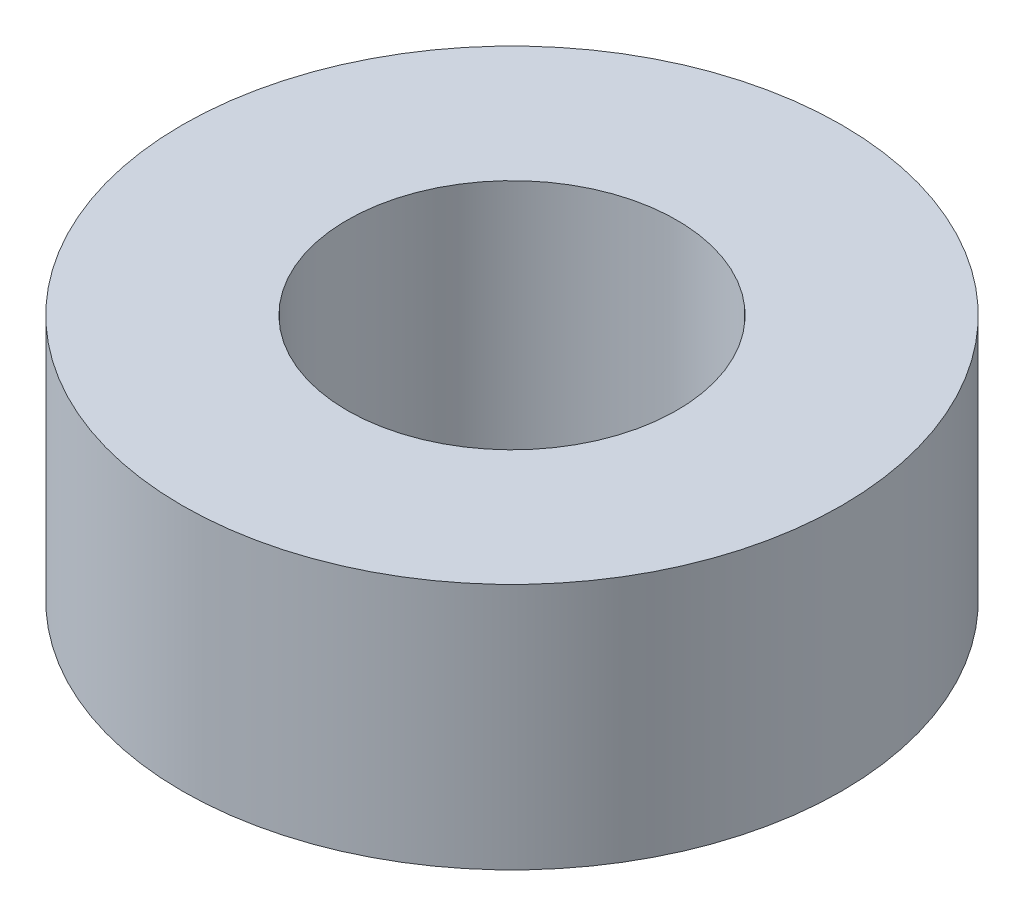
ISO-10303-21;
HEADER;
FILE_DESCRIPTION(('STEP AP214'),'2;1');
FILE_NAME('part.step','',(''),(''),'','','');
FILE_SCHEMA(('AUTOMOTIVE_DESIGN { 1 0 10303 214 1 1 1 1 }'));
ENDSEC;
DATA;
#1=APPLICATION_CONTEXT('core data for automotive mechanical design processes');
#2=APPLICATION_PROTOCOL_DEFINITION('international standard','automotive_design',2000,#1);
#3=PRODUCT_CONTEXT('',#1,'mechanical');
#4=PRODUCT('Part','Part','',(#3));
#5=PRODUCT_RELATED_PRODUCT_CATEGORY('part','',(#4));
#6=PRODUCT_DEFINITION_FORMATION('','',#4);
#7=PRODUCT_DEFINITION_CONTEXT('part definition',#1,'design');
#8=PRODUCT_DEFINITION('design','',#6,#7);
#9=PRODUCT_DEFINITION_SHAPE('','',#8);
#10=(LENGTH_UNIT() NAMED_UNIT(*) SI_UNIT(.MILLI.,.METRE.));
#11=(NAMED_UNIT(*) PLANE_ANGLE_UNIT() SI_UNIT($,.RADIAN.));
#12=(NAMED_UNIT(*) SI_UNIT($,.STERADIAN.) SOLID_ANGLE_UNIT());
#13=UNCERTAINTY_MEASURE_WITH_UNIT(LENGTH_MEASURE(1.E-05),#10,'distance_accuracy_value','');
#14=(GEOMETRIC_REPRESENTATION_CONTEXT(3) GLOBAL_UNCERTAINTY_ASSIGNED_CONTEXT((#13)) GLOBAL_UNIT_ASSIGNED_CONTEXT((#10,
#11,#12)) REPRESENTATION_CONTEXT('',''));
#15=CARTESIAN_POINT('',(0.,0.,0.));
#16=DIRECTION('',(0.,0.,1.));
#17=DIRECTION('',(1.,0.,0.));
#18=AXIS2_PLACEMENT_3D('',#15,#16,#17);
#19=CARTESIAN_POINT('',(0.,3.,0.));
#20=DIRECTION('',(0.,1.,0.));
#21=DIRECTION('',(0.,0.,1.));
#22=AXIS2_PLACEMENT_3D('',#19,#20,#21);
#23=PLANE('',#22);
#24=CARTESIAN_POINT('',(0.,3.,0.));
#25=DIRECTION('',(0.,1.,0.));
#26=DIRECTION('',(0.,0.,1.));
#27=AXIS2_PLACEMENT_3D('',#24,#25,#26);
#28=CIRCLE('',#27,4.);
#29=CARTESIAN_POINT('',(0.,3.,4.));
#30=VERTEX_POINT('',#29);
#31=EDGE_CURVE('E11',#30,#30,#28,.T.);
#32=ORIENTED_EDGE('',*,*,#31,.T.);
#33=EDGE_LOOP('',(#32));
#34=FACE_BOUND('',#33,.T.);
#35=CARTESIAN_POINT('',(0.,3.,0.));
#36=DIRECTION('',(0.,1.,0.));
#37=DIRECTION('',(0.,0.,1.));
#38=AXIS2_PLACEMENT_3D('',#35,#36,#37);
#39=CIRCLE('',#38,2.);
#40=CARTESIAN_POINT('',(0.,3.,2.));
#41=VERTEX_POINT('',#40);
#42=EDGE_CURVE('E94',#41,#41,#39,.T.);
#43=ORIENTED_EDGE('',*,*,#42,.F.);
#44=EDGE_LOOP('',(#43));
#45=FACE_BOUND('',#44,.T.);
#46=ADVANCED_FACE('F83',(#34,#45),#23,.T.);
#47=CARTESIAN_POINT('',(0.,0.,0.));
#48=DIRECTION('',(0.,1.,0.));
#49=DIRECTION('',(0.,0.,1.));
#50=AXIS2_PLACEMENT_3D('',#47,#48,#49);
#51=PLANE('',#50);
#52=CARTESIAN_POINT('',(0.,0.,0.));
#53=DIRECTION('',(0.,1.,0.));
#54=DIRECTION('',(0.,0.,1.));
#55=AXIS2_PLACEMENT_3D('',#52,#53,#54);
#56=CIRCLE('',#55,4.);
#57=CARTESIAN_POINT('',(0.,0.,4.));
#58=VERTEX_POINT('',#57);
#59=EDGE_CURVE('E82',#58,#58,#56,.T.);
#60=ORIENTED_EDGE('',*,*,#59,.F.);
#61=EDGE_LOOP('',(#60));
#62=FACE_BOUND('',#61,.T.);
#63=CARTESIAN_POINT('',(0.,0.,0.));
#64=DIRECTION('',(0.,1.,0.));
#65=DIRECTION('',(0.,0.,1.));
#66=AXIS2_PLACEMENT_3D('',#63,#64,#65);
#67=CIRCLE('',#66,2.);
#68=CARTESIAN_POINT('',(0.,0.,2.));
#69=VERTEX_POINT('',#68);
#70=EDGE_CURVE('E100',#69,#69,#67,.T.);
#71=ORIENTED_EDGE('',*,*,#70,.T.);
#72=EDGE_LOOP('',(#71));
#73=FACE_BOUND('',#72,.T.);
#74=ADVANCED_FACE('F107',(#62,#73),#51,.F.);
#75=CARTESIAN_POINT('',(0.,3.,0.));
#76=DIRECTION('',(0.,-1.,0.));
#77=DIRECTION('',(0.,0.,-1.));
#78=AXIS2_PLACEMENT_3D('',#75,#76,#77);
#79=CYLINDRICAL_SURFACE('',#78,4.);
#80=ORIENTED_EDGE('',*,*,#31,.F.);
#81=EDGE_LOOP('',(#80));
#82=FACE_BOUND('',#81,.T.);
#83=ORIENTED_EDGE('',*,*,#59,.T.);
#84=EDGE_LOOP('',(#83));
#85=FACE_BOUND('',#84,.T.);
#86=ADVANCED_FACE('F81',(#82,#85),#79,.T.);
#87=CARTESIAN_POINT('',(0.,3.,0.));
#88=DIRECTION('',(0.,-1.,0.));
#89=DIRECTION('',(0.,0.,-1.));
#90=AXIS2_PLACEMENT_3D('',#87,#88,#89);
#91=CYLINDRICAL_SURFACE('',#90,2.);
#92=ORIENTED_EDGE('',*,*,#42,.T.);
#93=EDGE_LOOP('',(#92));
#94=FACE_BOUND('',#93,.T.);
#95=ORIENTED_EDGE('',*,*,#70,.F.);
#96=EDGE_LOOP('',(#95));
#97=FACE_BOUND('',#96,.T.);
#98=ADVANCED_FACE('F104',(#94,#97),#91,.F.);
#99=CLOSED_SHELL('',(#46,#74,#86,#98));
#100=MANIFOLD_SOLID_BREP('B2',#99);
#101=ADVANCED_BREP_SHAPE_REPRESENTATION('',(#18,#100),#14);
#102=SHAPE_DEFINITION_REPRESENTATION(#9,#101);
ENDSEC;
END-ISO-10303-21;
